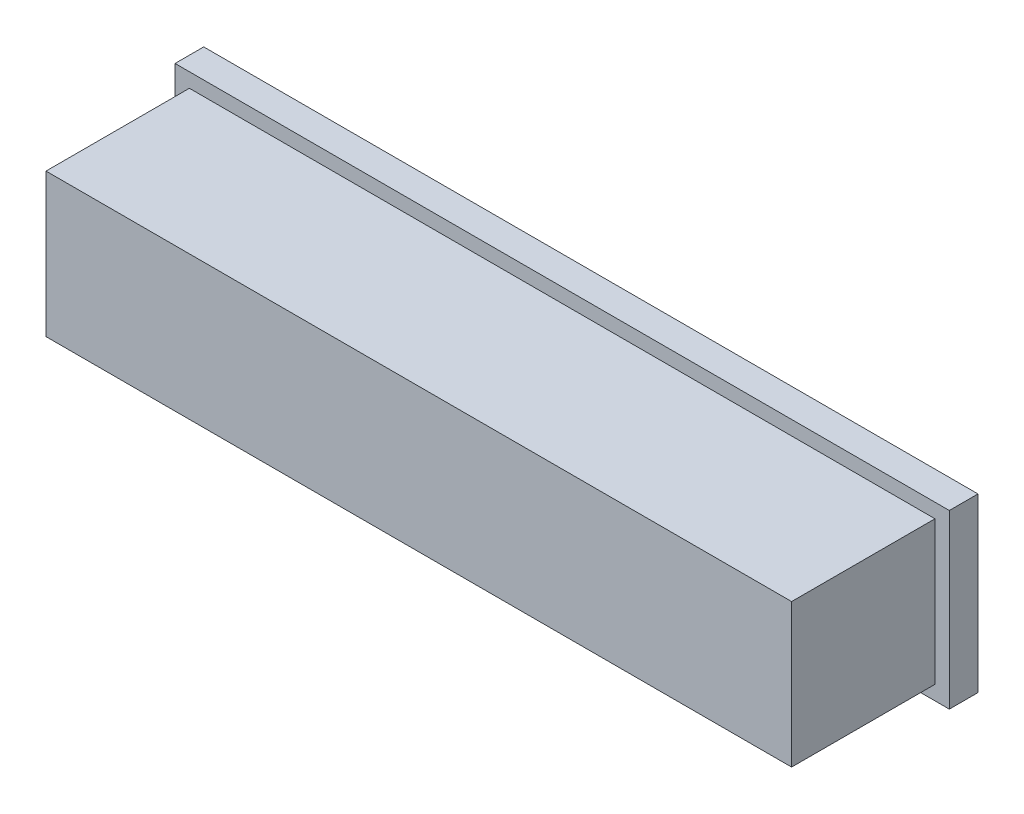
ISO-10303-21;
HEADER;
FILE_DESCRIPTION(('STEP AP214'),'2;1');
FILE_NAME('part.step','',(''),(''),'','','');
FILE_SCHEMA(('AUTOMOTIVE_DESIGN { 1 0 10303 214 1 1 1 1 }'));
ENDSEC;
DATA;
#1=APPLICATION_CONTEXT('core data for automotive mechanical design processes');
#2=APPLICATION_PROTOCOL_DEFINITION('international standard','automotive_design',2000,#1);
#3=PRODUCT_CONTEXT('',#1,'mechanical');
#4=PRODUCT('Part','Part','',(#3));
#5=PRODUCT_RELATED_PRODUCT_CATEGORY('part','',(#4));
#6=PRODUCT_DEFINITION_FORMATION('','',#4);
#7=PRODUCT_DEFINITION_CONTEXT('part definition',#1,'design');
#8=PRODUCT_DEFINITION('design','',#6,#7);
#9=PRODUCT_DEFINITION_SHAPE('','',#8);
#10=(LENGTH_UNIT() NAMED_UNIT(*) SI_UNIT(.MILLI.,.METRE.));
#11=(NAMED_UNIT(*) PLANE_ANGLE_UNIT() SI_UNIT($,.RADIAN.));
#12=(NAMED_UNIT(*) SI_UNIT($,.STERADIAN.) SOLID_ANGLE_UNIT());
#13=UNCERTAINTY_MEASURE_WITH_UNIT(LENGTH_MEASURE(1.E-05),#10,'distance_accuracy_value','');
#14=(GEOMETRIC_REPRESENTATION_CONTEXT(3) GLOBAL_UNCERTAINTY_ASSIGNED_CONTEXT((#13)) GLOBAL_UNIT_ASSIGNED_CONTEXT((#10,
#11,#12)) REPRESENTATION_CONTEXT('',''));
#15=CARTESIAN_POINT('',(0.,0.,0.));
#16=DIRECTION('',(0.,0.,1.));
#17=DIRECTION('',(1.,0.,0.));
#18=AXIS2_PLACEMENT_3D('',#15,#16,#17);
#19=CARTESIAN_POINT('',(135.,30.,10.));
#20=DIRECTION('',(-1.,0.,0.));
#21=DIRECTION('',(0.,0.,1.));
#22=AXIS2_PLACEMENT_3D('',#19,#20,#21);
#23=PLANE('',#22);
#24=DIRECTION('',(0.,1.,0.));
#25=VECTOR('',#24,1.);
#26=CARTESIAN_POINT('',(135.,30.,0.));
#27=LINE('',#26,#25);
#28=CARTESIAN_POINT('',(135.,-30.,0.));
#29=VERTEX_POINT('',#28);
#30=CARTESIAN_POINT('',(135.,30.,0.));
#31=VERTEX_POINT('',#30);
#32=EDGE_CURVE('E127',#29,#31,#27,.T.);
#33=ORIENTED_EDGE('',*,*,#32,.T.);
#34=DIRECTION('',(0.,0.,-1.));
#35=VECTOR('',#34,1.);
#36=CARTESIAN_POINT('',(135.,30.,10.));
#37=LINE('',#36,#35);
#38=CARTESIAN_POINT('',(135.,30.,10.));
#39=VERTEX_POINT('',#38);
#40=EDGE_CURVE('E11',#39,#31,#37,.T.);
#41=ORIENTED_EDGE('',*,*,#40,.F.);
#42=DIRECTION('',(0.,1.,0.));
#43=VECTOR('',#42,1.);
#44=CARTESIAN_POINT('',(135.,30.,10.));
#45=LINE('',#44,#43);
#46=CARTESIAN_POINT('',(135.,-30.,10.));
#47=VERTEX_POINT('',#46);
#48=EDGE_CURVE('E138',#47,#39,#45,.T.);
#49=ORIENTED_EDGE('',*,*,#48,.F.);
#50=DIRECTION('',(0.,0.,-1.));
#51=VECTOR('',#50,1.);
#52=CARTESIAN_POINT('',(135.,-30.,10.));
#53=LINE('',#52,#51);
#54=EDGE_CURVE('E151',#47,#29,#53,.T.);
#55=ORIENTED_EDGE('',*,*,#54,.T.);
#56=EDGE_LOOP('',(#33,#41,#49,#55));
#57=FACE_BOUND('',#56,.T.);
#58=ADVANCED_FACE('F39',(#57),#23,.F.);
#59=CARTESIAN_POINT('',(-135.,30.,10.));
#60=DIRECTION('',(0.,-1.,0.));
#61=DIRECTION('',(0.,0.,-1.));
#62=AXIS2_PLACEMENT_3D('',#59,#60,#61);
#63=PLANE('',#62);
#64=DIRECTION('',(-1.,0.,0.));
#65=VECTOR('',#64,1.);
#66=CARTESIAN_POINT('',(-135.,30.,0.));
#67=LINE('',#66,#65);
#68=CARTESIAN_POINT('',(-135.,30.,0.));
#69=VERTEX_POINT('',#68);
#70=EDGE_CURVE('E132',#31,#69,#67,.T.);
#71=ORIENTED_EDGE('',*,*,#70,.T.);
#72=DIRECTION('',(0.,0.,-1.));
#73=VECTOR('',#72,1.);
#74=CARTESIAN_POINT('',(-135.,30.,10.));
#75=LINE('',#74,#73);
#76=CARTESIAN_POINT('',(-135.,30.,10.));
#77=VERTEX_POINT('',#76);
#78=EDGE_CURVE('E47',#77,#69,#75,.T.);
#79=ORIENTED_EDGE('',*,*,#78,.F.);
#80=DIRECTION('',(-1.,0.,0.));
#81=VECTOR('',#80,1.);
#82=CARTESIAN_POINT('',(-135.,30.,10.));
#83=LINE('',#82,#81);
#84=EDGE_CURVE('E142',#39,#77,#83,.T.);
#85=ORIENTED_EDGE('',*,*,#84,.F.);
#86=ORIENTED_EDGE('',*,*,#40,.T.);
#87=EDGE_LOOP('',(#71,#79,#85,#86));
#88=FACE_BOUND('',#87,.T.);
#89=ADVANCED_FACE('F188',(#88),#63,.F.);
#90=CARTESIAN_POINT('',(-135.,30.,10.));
#91=DIRECTION('',(1.,0.,0.));
#92=DIRECTION('',(0.,1.,0.));
#93=AXIS2_PLACEMENT_3D('',#90,#91,#92);
#94=PLANE('',#93);
#95=DIRECTION('',(0.,-1.,0.));
#96=VECTOR('',#95,1.);
#97=CARTESIAN_POINT('',(-135.,30.,0.));
#98=LINE('',#97,#96);
#99=CARTESIAN_POINT('',(-135.,-30.,0.));
#100=VERTEX_POINT('',#99);
#101=EDGE_CURVE('E155',#69,#100,#98,.T.);
#102=ORIENTED_EDGE('',*,*,#101,.T.);
#103=DIRECTION('',(0.,0.,-1.));
#104=VECTOR('',#103,1.);
#105=CARTESIAN_POINT('',(-135.,-30.,10.));
#106=LINE('',#105,#104);
#107=CARTESIAN_POINT('',(-135.,-30.,10.));
#108=VERTEX_POINT('',#107);
#109=EDGE_CURVE('E163',#108,#100,#106,.T.);
#110=ORIENTED_EDGE('',*,*,#109,.F.);
#111=DIRECTION('',(0.,-1.,0.));
#112=VECTOR('',#111,1.);
#113=CARTESIAN_POINT('',(-135.,30.,10.));
#114=LINE('',#113,#112);
#115=EDGE_CURVE('E146',#77,#108,#114,.T.);
#116=ORIENTED_EDGE('',*,*,#115,.F.);
#117=ORIENTED_EDGE('',*,*,#78,.T.);
#118=EDGE_LOOP('',(#102,#110,#116,#117));
#119=FACE_BOUND('',#118,.T.);
#120=ADVANCED_FACE('F172',(#119),#94,.F.);
#121=CARTESIAN_POINT('',(-135.,-30.,10.));
#122=DIRECTION('',(0.,1.,0.));
#123=DIRECTION('',(0.,0.,1.));
#124=AXIS2_PLACEMENT_3D('',#121,#122,#123);
#125=PLANE('',#124);
#126=DIRECTION('',(1.,0.,0.));
#127=VECTOR('',#126,1.);
#128=CARTESIAN_POINT('',(-135.,-30.,0.));
#129=LINE('',#128,#127);
#130=EDGE_CURVE('E143',#100,#29,#129,.T.);
#131=ORIENTED_EDGE('',*,*,#130,.T.);
#132=ORIENTED_EDGE('',*,*,#54,.F.);
#133=DIRECTION('',(1.,0.,0.));
#134=VECTOR('',#133,1.);
#135=CARTESIAN_POINT('',(-135.,-30.,10.));
#136=LINE('',#135,#134);
#137=EDGE_CURVE('E149',#108,#47,#136,.T.);
#138=ORIENTED_EDGE('',*,*,#137,.F.);
#139=ORIENTED_EDGE('',*,*,#109,.T.);
#140=EDGE_LOOP('',(#131,#132,#138,#139));
#141=FACE_BOUND('',#140,.T.);
#142=ADVANCED_FACE('F181',(#141),#125,.F.);
#143=CARTESIAN_POINT('',(0.,0.,10.));
#144=DIRECTION('',(0.,0.,1.));
#145=DIRECTION('',(1.,0.,0.));
#146=AXIS2_PLACEMENT_3D('',#143,#144,#145);
#147=PLANE('',#146);
#148=DIRECTION('',(0.,1.,0.));
#149=VECTOR('',#148,1.);
#150=CARTESIAN_POINT('',(130.,25.,10.));
#151=LINE('',#150,#149);
#152=CARTESIAN_POINT('',(130.,-25.,10.));
#153=VERTEX_POINT('',#152);
#154=CARTESIAN_POINT('',(130.,25.,10.));
#155=VERTEX_POINT('',#154);
#156=EDGE_CURVE('E54',#153,#155,#151,.T.);
#157=ORIENTED_EDGE('',*,*,#156,.F.);
#158=DIRECTION('',(1.,0.,0.));
#159=VECTOR('',#158,1.);
#160=CARTESIAN_POINT('',(-130.,-25.,10.));
#161=LINE('',#160,#159);
#162=CARTESIAN_POINT('',(-130.,-25.,10.));
#163=VERTEX_POINT('',#162);
#164=EDGE_CURVE('E58',#163,#153,#161,.T.);
#165=ORIENTED_EDGE('',*,*,#164,.F.);
#166=DIRECTION('',(0.,-1.,0.));
#167=VECTOR('',#166,1.);
#168=CARTESIAN_POINT('',(-130.,25.,10.));
#169=LINE('',#168,#167);
#170=CARTESIAN_POINT('',(-130.,25.,10.));
#171=VERTEX_POINT('',#170);
#172=EDGE_CURVE('E283',#171,#163,#169,.T.);
#173=ORIENTED_EDGE('',*,*,#172,.F.);
#174=DIRECTION('',(-1.,0.,0.));
#175=VECTOR('',#174,1.);
#176=CARTESIAN_POINT('',(-130.,25.,10.));
#177=LINE('',#176,#175);
#178=EDGE_CURVE('E293',#155,#171,#177,.T.);
#179=ORIENTED_EDGE('',*,*,#178,.F.);
#180=EDGE_LOOP('',(#157,#165,#173,#179));
#181=FACE_BOUND('',#180,.T.);
#182=ORIENTED_EDGE('',*,*,#48,.T.);
#183=ORIENTED_EDGE('',*,*,#84,.T.);
#184=ORIENTED_EDGE('',*,*,#115,.T.);
#185=ORIENTED_EDGE('',*,*,#137,.T.);
#186=EDGE_LOOP('',(#182,#183,#184,#185));
#187=FACE_BOUND('',#186,.T.);
#188=ADVANCED_FACE('F187',(#181,#187),#147,.T.);
#189=CARTESIAN_POINT('',(0.,0.,0.));
#190=DIRECTION('',(0.,0.,1.));
#191=DIRECTION('',(1.,0.,0.));
#192=AXIS2_PLACEMENT_3D('',#189,#190,#191);
#193=PLANE('',#192);
#194=ORIENTED_EDGE('',*,*,#32,.F.);
#195=ORIENTED_EDGE('',*,*,#130,.F.);
#196=ORIENTED_EDGE('',*,*,#101,.F.);
#197=ORIENTED_EDGE('',*,*,#70,.F.);
#198=EDGE_LOOP('',(#194,#195,#196,#197));
#199=FACE_BOUND('',#198,.T.);
#200=ADVANCED_FACE('F178',(#199),#193,.F.);
#201=CARTESIAN_POINT('',(130.,25.,60.));
#202=DIRECTION('',(-1.,0.,0.));
#203=DIRECTION('',(0.,0.,1.));
#204=AXIS2_PLACEMENT_3D('',#201,#202,#203);
#205=PLANE('',#204);
#206=ORIENTED_EDGE('',*,*,#156,.T.);
#207=DIRECTION('',(0.,0.,-1.));
#208=VECTOR('',#207,1.);
#209=CARTESIAN_POINT('',(130.,25.,60.));
#210=LINE('',#209,#208);
#211=CARTESIAN_POINT('',(130.,25.,60.));
#212=VERTEX_POINT('',#211);
#213=EDGE_CURVE('E107',#212,#155,#210,.T.);
#214=ORIENTED_EDGE('',*,*,#213,.F.);
#215=DIRECTION('',(0.,1.,0.));
#216=VECTOR('',#215,1.);
#217=CARTESIAN_POINT('',(130.,25.,60.));
#218=LINE('',#217,#216);
#219=CARTESIAN_POINT('',(130.,-25.,60.));
#220=VERTEX_POINT('',#219);
#221=EDGE_CURVE('E114',#220,#212,#218,.T.);
#222=ORIENTED_EDGE('',*,*,#221,.F.);
#223=DIRECTION('',(0.,0.,-1.));
#224=VECTOR('',#223,1.);
#225=CARTESIAN_POINT('',(130.,-25.,60.));
#226=LINE('',#225,#224);
#227=EDGE_CURVE('E280',#220,#153,#226,.T.);
#228=ORIENTED_EDGE('',*,*,#227,.T.);
#229=EDGE_LOOP('',(#206,#214,#222,#228));
#230=FACE_BOUND('',#229,.T.);
#231=ADVANCED_FACE('F125',(#230),#205,.F.);
#232=CARTESIAN_POINT('',(-130.,25.,60.));
#233=DIRECTION('',(0.,-1.,0.));
#234=DIRECTION('',(0.,0.,-1.));
#235=AXIS2_PLACEMENT_3D('',#232,#233,#234);
#236=PLANE('',#235);
#237=ORIENTED_EDGE('',*,*,#178,.T.);
#238=DIRECTION('',(0.,0.,-1.));
#239=VECTOR('',#238,1.);
#240=CARTESIAN_POINT('',(-130.,25.,60.));
#241=LINE('',#240,#239);
#242=CARTESIAN_POINT('',(-130.,25.,60.));
#243=VERTEX_POINT('',#242);
#244=EDGE_CURVE('E109',#243,#171,#241,.T.);
#245=ORIENTED_EDGE('',*,*,#244,.F.);
#246=DIRECTION('',(-1.,0.,0.));
#247=VECTOR('',#246,1.);
#248=CARTESIAN_POINT('',(-130.,25.,60.));
#249=LINE('',#248,#247);
#250=EDGE_CURVE('E102',#212,#243,#249,.T.);
#251=ORIENTED_EDGE('',*,*,#250,.F.);
#252=ORIENTED_EDGE('',*,*,#213,.T.);
#253=EDGE_LOOP('',(#237,#245,#251,#252));
#254=FACE_BOUND('',#253,.T.);
#255=ADVANCED_FACE('F105',(#254),#236,.F.);
#256=CARTESIAN_POINT('',(-130.,25.,60.));
#257=DIRECTION('',(1.,0.,0.));
#258=DIRECTION('',(0.,0.,-1.));
#259=AXIS2_PLACEMENT_3D('',#256,#257,#258);
#260=PLANE('',#259);
#261=ORIENTED_EDGE('',*,*,#172,.T.);
#262=DIRECTION('',(0.,0.,-1.));
#263=VECTOR('',#262,1.);
#264=CARTESIAN_POINT('',(-130.,-25.,60.));
#265=LINE('',#264,#263);
#266=CARTESIAN_POINT('',(-130.,-25.,60.));
#267=VERTEX_POINT('',#266);
#268=EDGE_CURVE('E134',#267,#163,#265,.T.);
#269=ORIENTED_EDGE('',*,*,#268,.F.);
#270=DIRECTION('',(0.,-1.,0.));
#271=VECTOR('',#270,1.);
#272=CARTESIAN_POINT('',(-130.,25.,60.));
#273=LINE('',#272,#271);
#274=EDGE_CURVE('E113',#243,#267,#273,.T.);
#275=ORIENTED_EDGE('',*,*,#274,.F.);
#276=ORIENTED_EDGE('',*,*,#244,.T.);
#277=EDGE_LOOP('',(#261,#269,#275,#276));
#278=FACE_BOUND('',#277,.T.);
#279=ADVANCED_FACE('F206',(#278),#260,.F.);
#280=CARTESIAN_POINT('',(-130.,-25.,60.));
#281=DIRECTION('',(0.,1.,0.));
#282=DIRECTION('',(0.,0.,1.));
#283=AXIS2_PLACEMENT_3D('',#280,#281,#282);
#284=PLANE('',#283);
#285=ORIENTED_EDGE('',*,*,#164,.T.);
#286=ORIENTED_EDGE('',*,*,#227,.F.);
#287=DIRECTION('',(1.,0.,0.));
#288=VECTOR('',#287,1.);
#289=CARTESIAN_POINT('',(-130.,-25.,60.));
#290=LINE('',#289,#288);
#291=EDGE_CURVE('E119',#267,#220,#290,.T.);
#292=ORIENTED_EDGE('',*,*,#291,.F.);
#293=ORIENTED_EDGE('',*,*,#268,.T.);
#294=EDGE_LOOP('',(#285,#286,#292,#293));
#295=FACE_BOUND('',#294,.T.);
#296=ADVANCED_FACE('F209',(#295),#284,.F.);
#297=CARTESIAN_POINT('',(0.,0.,60.));
#298=DIRECTION('',(0.,0.,1.));
#299=DIRECTION('',(1.,0.,0.));
#300=AXIS2_PLACEMENT_3D('',#297,#298,#299);
#301=PLANE('',#300);
#302=ORIENTED_EDGE('',*,*,#221,.T.);
#303=ORIENTED_EDGE('',*,*,#250,.T.);
#304=ORIENTED_EDGE('',*,*,#274,.T.);
#305=ORIENTED_EDGE('',*,*,#291,.T.);
#306=EDGE_LOOP('',(#302,#303,#304,#305));
#307=FACE_BOUND('',#306,.T.);
#308=ADVANCED_FACE('F117',(#307),#301,.T.);
#309=CLOSED_SHELL('',(#58,#89,#120,#142,#188,#200,#231,#255,#279,#296,#308));
#310=MANIFOLD_SOLID_BREP('B2',#309);
#311=ADVANCED_BREP_SHAPE_REPRESENTATION('',(#18,#310),#14);
#312=SHAPE_DEFINITION_REPRESENTATION(#9,#311);
ENDSEC;
END-ISO-10303-21;
